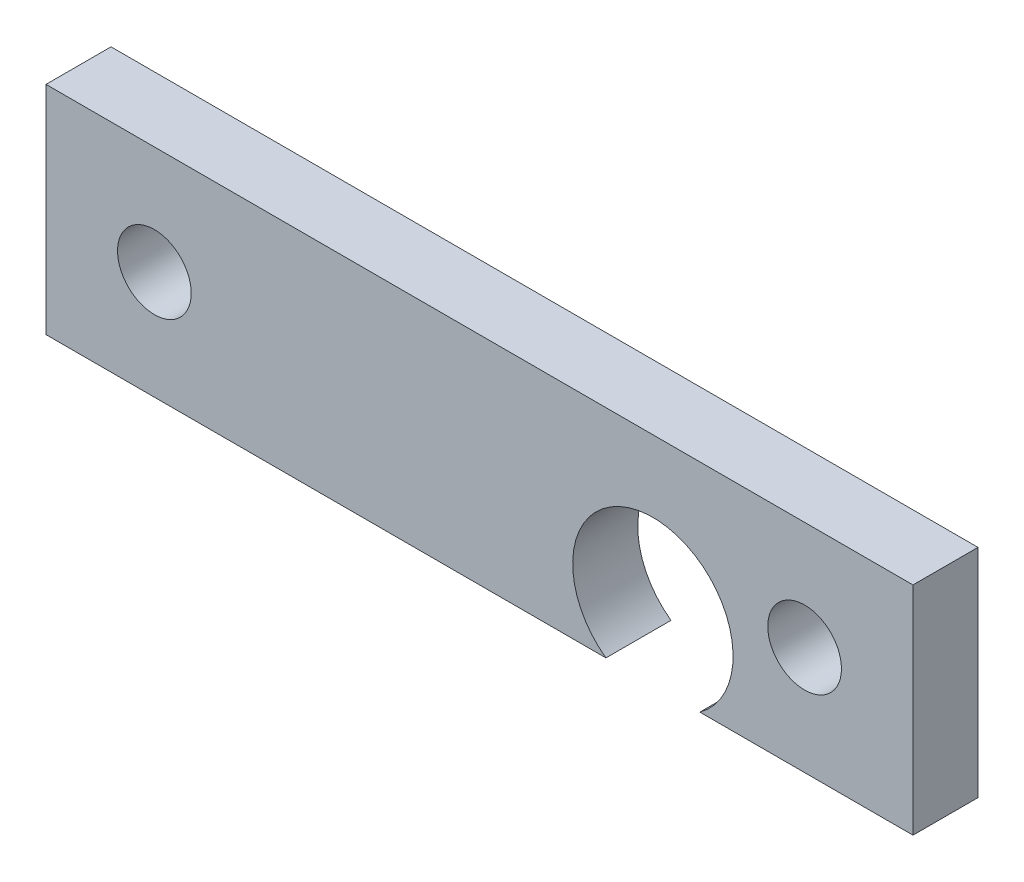
ISO-10303-21;
HEADER;
FILE_DESCRIPTION(('STEP AP214'),'2;1');
FILE_NAME('part.step','',(''),(''),'','','');
FILE_SCHEMA(('AUTOMOTIVE_DESIGN { 1 0 10303 214 1 1 1 1 }'));
ENDSEC;
DATA;
#1=APPLICATION_CONTEXT('core data for automotive mechanical design processes');
#2=APPLICATION_PROTOCOL_DEFINITION('international standard','automotive_design',2000,#1);
#3=PRODUCT_CONTEXT('',#1,'mechanical');
#4=PRODUCT('Part','Part','',(#3));
#5=PRODUCT_RELATED_PRODUCT_CATEGORY('part','',(#4));
#6=PRODUCT_DEFINITION_FORMATION('','',#4);
#7=PRODUCT_DEFINITION_CONTEXT('part definition',#1,'design');
#8=PRODUCT_DEFINITION('design','',#6,#7);
#9=PRODUCT_DEFINITION_SHAPE('','',#8);
#10=(LENGTH_UNIT() NAMED_UNIT(*) SI_UNIT(.MILLI.,.METRE.));
#11=(NAMED_UNIT(*) PLANE_ANGLE_UNIT() SI_UNIT($,.RADIAN.));
#12=(NAMED_UNIT(*) SI_UNIT($,.STERADIAN.) SOLID_ANGLE_UNIT());
#13=UNCERTAINTY_MEASURE_WITH_UNIT(LENGTH_MEASURE(1.E-05),#10,'distance_accuracy_value','');
#14=(GEOMETRIC_REPRESENTATION_CONTEXT(3) GLOBAL_UNCERTAINTY_ASSIGNED_CONTEXT((#13)) GLOBAL_UNIT_ASSIGNED_CONTEXT((#10,
#11,#12)) REPRESENTATION_CONTEXT('',''));
#15=CARTESIAN_POINT('',(0.,0.,0.));
#16=DIRECTION('',(0.,0.,1.));
#17=DIRECTION('',(1.,0.,0.));
#18=AXIS2_PLACEMENT_3D('',#15,#16,#17);
#19=CARTESIAN_POINT('',(-130.,41.5,41.5));
#20=DIRECTION('',(-1.,0.,0.));
#21=DIRECTION('',(0.,0.,1.));
#22=AXIS2_PLACEMENT_3D('',#19,#20,#21);
#23=PLANE('',#22);
#24=DIRECTION('',(0.,-1.,0.));
#25=VECTOR('',#24,1.);
#26=CARTESIAN_POINT('',(-130.,41.5,44.5));
#27=LINE('',#26,#25);
#28=CARTESIAN_POINT('',(-130.,41.5,44.5));
#29=VERTEX_POINT('',#28);
#30=CARTESIAN_POINT('',(-130.,31.5,44.5));
#31=VERTEX_POINT('',#30);
#32=EDGE_CURVE('E127',#29,#31,#27,.T.);
#33=ORIENTED_EDGE('',*,*,#32,.F.);
#34=DIRECTION('',(0.,0.,1.));
#35=VECTOR('',#34,1.);
#36=CARTESIAN_POINT('',(-130.,41.5,41.5));
#37=LINE('',#36,#35);
#38=CARTESIAN_POINT('',(-130.,41.5,41.5));
#39=VERTEX_POINT('',#38);
#40=EDGE_CURVE('E11',#39,#29,#37,.T.);
#41=ORIENTED_EDGE('',*,*,#40,.F.);
#42=DIRECTION('',(0.,-1.,0.));
#43=VECTOR('',#42,1.);
#44=CARTESIAN_POINT('',(-130.,41.5,41.5));
#45=LINE('',#44,#43);
#46=CARTESIAN_POINT('',(-130.,31.5,41.5));
#47=VERTEX_POINT('',#46);
#48=EDGE_CURVE('E143',#39,#47,#45,.T.);
#49=ORIENTED_EDGE('',*,*,#48,.T.);
#50=DIRECTION('',(0.,0.,1.));
#51=VECTOR('',#50,1.);
#52=CARTESIAN_POINT('',(-130.,31.5,41.5));
#53=LINE('',#52,#51);
#54=EDGE_CURVE('E42',#47,#31,#53,.T.);
#55=ORIENTED_EDGE('',*,*,#54,.T.);
#56=EDGE_LOOP('',(#33,#41,#49,#55));
#57=FACE_BOUND('',#56,.T.);
#58=ADVANCED_FACE('F41',(#57),#23,.T.);
#59=CARTESIAN_POINT('',(-130.,41.5,41.5));
#60=DIRECTION('',(0.,1.,0.));
#61=DIRECTION('',(0.,0.,1.));
#62=AXIS2_PLACEMENT_3D('',#59,#60,#61);
#63=PLANE('',#62);
#64=DIRECTION('',(-1.,0.,0.));
#65=VECTOR('',#64,1.);
#66=CARTESIAN_POINT('',(-130.,41.5,44.5));
#67=LINE('',#66,#65);
#68=CARTESIAN_POINT('',(-90.,41.5,44.5));
#69=VERTEX_POINT('',#68);
#70=EDGE_CURVE('E136',#69,#29,#67,.T.);
#71=ORIENTED_EDGE('',*,*,#70,.F.);
#72=DIRECTION('',(0.,0.,1.));
#73=VECTOR('',#72,1.);
#74=CARTESIAN_POINT('',(-90.,41.5,41.5));
#75=LINE('',#74,#73);
#76=CARTESIAN_POINT('',(-90.,41.5,41.5));
#77=VERTEX_POINT('',#76);
#78=EDGE_CURVE('E49',#77,#69,#75,.T.);
#79=ORIENTED_EDGE('',*,*,#78,.F.);
#80=DIRECTION('',(-1.,0.,0.));
#81=VECTOR('',#80,1.);
#82=CARTESIAN_POINT('',(-130.,41.5,41.5));
#83=LINE('',#82,#81);
#84=EDGE_CURVE('E117',#77,#39,#83,.T.);
#85=ORIENTED_EDGE('',*,*,#84,.T.);
#86=ORIENTED_EDGE('',*,*,#40,.T.);
#87=EDGE_LOOP('',(#71,#79,#85,#86));
#88=FACE_BOUND('',#87,.T.);
#89=ADVANCED_FACE('F149',(#88),#63,.T.);
#90=CARTESIAN_POINT('',(-90.,41.5,41.5));
#91=DIRECTION('',(1.,0.,0.));
#92=DIRECTION('',(0.,0.,-1.));
#93=AXIS2_PLACEMENT_3D('',#90,#91,#92);
#94=PLANE('',#93);
#95=DIRECTION('',(0.,1.,0.));
#96=VECTOR('',#95,1.);
#97=CARTESIAN_POINT('',(-90.,41.5,44.5));
#98=LINE('',#97,#96);
#99=CARTESIAN_POINT('',(-90.,31.5,44.5));
#100=VERTEX_POINT('',#99);
#101=EDGE_CURVE('E103',#100,#69,#98,.T.);
#102=ORIENTED_EDGE('',*,*,#101,.F.);
#103=DIRECTION('',(0.,0.,1.));
#104=VECTOR('',#103,1.);
#105=CARTESIAN_POINT('',(-90.,31.5,41.5));
#106=LINE('',#105,#104);
#107=CARTESIAN_POINT('',(-90.,31.5,41.5));
#108=VERTEX_POINT('',#107);
#109=EDGE_CURVE('E98',#108,#100,#106,.T.);
#110=ORIENTED_EDGE('',*,*,#109,.F.);
#111=DIRECTION('',(0.,1.,0.));
#112=VECTOR('',#111,1.);
#113=CARTESIAN_POINT('',(-90.,41.5,41.5));
#114=LINE('',#113,#112);
#115=EDGE_CURVE('E101',#108,#77,#114,.T.);
#116=ORIENTED_EDGE('',*,*,#115,.T.);
#117=ORIENTED_EDGE('',*,*,#78,.T.);
#118=EDGE_LOOP('',(#102,#110,#116,#117));
#119=FACE_BOUND('',#118,.T.);
#120=ADVANCED_FACE('F99',(#119),#94,.T.);
#121=CARTESIAN_POINT('',(-99.8343592172292,31.5,41.5));
#122=DIRECTION('',(0.,-1.,0.));
#123=DIRECTION('',(0.,0.,-1.));
#124=AXIS2_PLACEMENT_3D('',#121,#122,#123);
#125=PLANE('',#124);
#126=DIRECTION('',(1.,0.,0.));
#127=VECTOR('',#126,1.);
#128=CARTESIAN_POINT('',(-99.8343592172292,31.5,44.5));
#129=LINE('',#128,#127);
#130=CARTESIAN_POINT('',(-99.8343592172292,31.5,44.5));
#131=VERTEX_POINT('',#130);
#132=EDGE_CURVE('E137',#131,#100,#129,.T.);
#133=ORIENTED_EDGE('',*,*,#132,.F.);
#134=DIRECTION('',(0.,0.,1.));
#135=VECTOR('',#134,1.);
#136=CARTESIAN_POINT('',(-99.8343592172292,31.5,41.5));
#137=LINE('',#136,#135);
#138=CARTESIAN_POINT('',(-99.8343592172292,31.5,41.5));
#139=VERTEX_POINT('',#138);
#140=EDGE_CURVE('E107',#139,#131,#137,.T.);
#141=ORIENTED_EDGE('',*,*,#140,.F.);
#142=DIRECTION('',(1.,0.,0.));
#143=VECTOR('',#142,1.);
#144=CARTESIAN_POINT('',(-99.8343592172292,31.5,41.5));
#145=LINE('',#144,#143);
#146=EDGE_CURVE('E111',#139,#108,#145,.T.);
#147=ORIENTED_EDGE('',*,*,#146,.T.);
#148=ORIENTED_EDGE('',*,*,#109,.T.);
#149=EDGE_LOOP('',(#133,#141,#147,#148));
#150=FACE_BOUND('',#149,.T.);
#151=ADVANCED_FACE('F119',(#150),#125,.T.);
#152=CARTESIAN_POINT('',(-102.,34.5,41.5));
#153=DIRECTION('',(0.,0.,1.));
#154=DIRECTION('',(1.,0.,0.));
#155=AXIS2_PLACEMENT_3D('',#152,#153,#154);
#156=CYLINDRICAL_SURFACE('',#155,3.69999999999998);
#157=CARTESIAN_POINT('',(-102.,34.5,44.5));
#158=DIRECTION('',(0.,0.,-1.));
#159=DIRECTION('',(1.,0.,0.));
#160=AXIS2_PLACEMENT_3D('',#157,#158,#159);
#161=CIRCLE('',#160,3.69999999999998);
#162=CARTESIAN_POINT('',(-104.165640782771,31.4999999999999,44.5));
#163=VERTEX_POINT('',#162);
#164=EDGE_CURVE('E134',#163,#131,#161,.T.);
#165=ORIENTED_EDGE('',*,*,#164,.F.);
#166=DIRECTION('',(0.,0.,1.));
#167=VECTOR('',#166,1.);
#168=CARTESIAN_POINT('',(-104.165640782771,31.4999999999999,41.5));
#169=LINE('',#168,#167);
#170=CARTESIAN_POINT('',(-104.165640782771,31.4999999999999,41.5));
#171=VERTEX_POINT('',#170);
#172=EDGE_CURVE('E145',#171,#163,#169,.T.);
#173=ORIENTED_EDGE('',*,*,#172,.F.);
#174=CARTESIAN_POINT('',(-102.,34.5,41.5));
#175=DIRECTION('',(0.,0.,-1.));
#176=DIRECTION('',(1.,0.,0.));
#177=AXIS2_PLACEMENT_3D('',#174,#175,#176);
#178=CIRCLE('',#177,3.69999999999998);
#179=EDGE_CURVE('E116',#171,#139,#178,.T.);
#180=ORIENTED_EDGE('',*,*,#179,.T.);
#181=ORIENTED_EDGE('',*,*,#140,.T.);
#182=EDGE_LOOP('',(#165,#173,#180,#181));
#183=FACE_BOUND('',#182,.T.);
#184=ADVANCED_FACE('F165',(#183),#156,.F.);
#185=CARTESIAN_POINT('',(-130.,31.5,41.5));
#186=DIRECTION('',(0.,-1.,0.));
#187=DIRECTION('',(1.,0.,0.));
#188=AXIS2_PLACEMENT_3D('',#185,#186,#187);
#189=PLANE('',#188);
#190=DIRECTION('',(1.,0.,0.));
#191=VECTOR('',#190,1.);
#192=CARTESIAN_POINT('',(-130.,31.5,44.5));
#193=LINE('',#192,#191);
#194=EDGE_CURVE('E129',#31,#163,#193,.T.);
#195=ORIENTED_EDGE('',*,*,#194,.F.);
#196=ORIENTED_EDGE('',*,*,#54,.F.);
#197=DIRECTION('',(1.,0.,0.));
#198=VECTOR('',#197,1.);
#199=CARTESIAN_POINT('',(-130.,31.5,41.5));
#200=LINE('',#199,#198);
#201=EDGE_CURVE('E122',#47,#171,#200,.T.);
#202=ORIENTED_EDGE('',*,*,#201,.T.);
#203=ORIENTED_EDGE('',*,*,#172,.T.);
#204=EDGE_LOOP('',(#195,#196,#202,#203));
#205=FACE_BOUND('',#204,.T.);
#206=ADVANCED_FACE('F148',(#205),#189,.T.);
#207=CARTESIAN_POINT('',(-102.,34.5,41.5));
#208=DIRECTION('',(0.,0.,1.));
#209=DIRECTION('',(1.,0.,0.));
#210=AXIS2_PLACEMENT_3D('',#207,#208,#209);
#211=PLANE('',#210);
#212=CARTESIAN_POINT('',(-95.,36.5,41.5));
#213=DIRECTION('',(0.,0.,1.));
#214=DIRECTION('',(1.,0.,0.));
#215=AXIS2_PLACEMENT_3D('',#212,#213,#214);
#216=CIRCLE('',#215,1.69999999999999);
#217=CARTESIAN_POINT('',(-93.3,36.5,41.5));
#218=VERTEX_POINT('',#217);
#219=EDGE_CURVE('E189',#218,#218,#216,.T.);
#220=ORIENTED_EDGE('',*,*,#219,.T.);
#221=EDGE_LOOP('',(#220));
#222=FACE_BOUND('',#221,.T.);
#223=CARTESIAN_POINT('',(-125.,36.5,41.5));
#224=DIRECTION('',(0.,0.,1.));
#225=DIRECTION('',(1.,0.,0.));
#226=AXIS2_PLACEMENT_3D('',#223,#224,#225);
#227=CIRCLE('',#226,1.69999999999999);
#228=CARTESIAN_POINT('',(-123.3,36.5,41.5));
#229=VERTEX_POINT('',#228);
#230=EDGE_CURVE('E128',#229,#229,#227,.T.);
#231=ORIENTED_EDGE('',*,*,#230,.T.);
#232=EDGE_LOOP('',(#231));
#233=FACE_BOUND('',#232,.T.);
#234=ORIENTED_EDGE('',*,*,#48,.F.);
#235=ORIENTED_EDGE('',*,*,#84,.F.);
#236=ORIENTED_EDGE('',*,*,#115,.F.);
#237=ORIENTED_EDGE('',*,*,#146,.F.);
#238=ORIENTED_EDGE('',*,*,#179,.F.);
#239=ORIENTED_EDGE('',*,*,#201,.F.);
#240=EDGE_LOOP('',(#234,#235,#236,#237,#238,#239));
#241=FACE_BOUND('',#240,.T.);
#242=ADVANCED_FACE('F115',(#222,#233,#241),#211,.F.);
#243=CARTESIAN_POINT('',(-102.,34.5,44.5));
#244=DIRECTION('',(0.,0.,1.));
#245=DIRECTION('',(1.,0.,0.));
#246=AXIS2_PLACEMENT_3D('',#243,#244,#245);
#247=PLANE('',#246);
#248=CARTESIAN_POINT('',(-95.,36.5,44.5));
#249=DIRECTION('',(0.,0.,1.));
#250=DIRECTION('',(1.,0.,0.));
#251=AXIS2_PLACEMENT_3D('',#248,#249,#250);
#252=CIRCLE('',#251,1.69999999999999);
#253=CARTESIAN_POINT('',(-93.3,36.5,44.5));
#254=VERTEX_POINT('',#253);
#255=EDGE_CURVE('E192',#254,#254,#252,.T.);
#256=ORIENTED_EDGE('',*,*,#255,.F.);
#257=EDGE_LOOP('',(#256));
#258=FACE_BOUND('',#257,.T.);
#259=CARTESIAN_POINT('',(-125.,36.5,44.5));
#260=DIRECTION('',(0.,0.,1.));
#261=DIRECTION('',(1.,0.,0.));
#262=AXIS2_PLACEMENT_3D('',#259,#260,#261);
#263=CIRCLE('',#262,1.69999999999999);
#264=CARTESIAN_POINT('',(-123.3,36.5,44.5));
#265=VERTEX_POINT('',#264);
#266=EDGE_CURVE('E194',#265,#265,#263,.T.);
#267=ORIENTED_EDGE('',*,*,#266,.F.);
#268=EDGE_LOOP('',(#267));
#269=FACE_BOUND('',#268,.T.);
#270=ORIENTED_EDGE('',*,*,#32,.T.);
#271=ORIENTED_EDGE('',*,*,#194,.T.);
#272=ORIENTED_EDGE('',*,*,#164,.T.);
#273=ORIENTED_EDGE('',*,*,#132,.T.);
#274=ORIENTED_EDGE('',*,*,#101,.T.);
#275=ORIENTED_EDGE('',*,*,#70,.T.);
#276=EDGE_LOOP('',(#270,#271,#272,#273,#274,#275));
#277=FACE_BOUND('',#276,.T.);
#278=ADVANCED_FACE('F146',(#258,#269,#277),#247,.T.);
#279=CARTESIAN_POINT('',(-125.,36.5,41.5));
#280=DIRECTION('',(0.,0.,1.));
#281=DIRECTION('',(1.,0.,0.));
#282=AXIS2_PLACEMENT_3D('',#279,#280,#281);
#283=CYLINDRICAL_SURFACE('',#282,1.69999999999999);
#284=ORIENTED_EDGE('',*,*,#230,.F.);
#285=EDGE_LOOP('',(#284));
#286=FACE_BOUND('',#285,.T.);
#287=ORIENTED_EDGE('',*,*,#266,.T.);
#288=EDGE_LOOP('',(#287));
#289=FACE_BOUND('',#288,.T.);
#290=ADVANCED_FACE('F174',(#286,#289),#283,.F.);
#291=CARTESIAN_POINT('',(-95.,36.5,41.5));
#292=DIRECTION('',(0.,0.,1.));
#293=DIRECTION('',(1.,0.,0.));
#294=AXIS2_PLACEMENT_3D('',#291,#292,#293);
#295=CYLINDRICAL_SURFACE('',#294,1.69999999999999);
#296=ORIENTED_EDGE('',*,*,#219,.F.);
#297=EDGE_LOOP('',(#296));
#298=FACE_BOUND('',#297,.T.);
#299=ORIENTED_EDGE('',*,*,#255,.T.);
#300=EDGE_LOOP('',(#299));
#301=FACE_BOUND('',#300,.T.);
#302=ADVANCED_FACE('F178',(#298,#301),#295,.F.);
#303=CLOSED_SHELL('',(#58,#89,#120,#151,#184,#206,#242,#278,#290,#302));
#304=MANIFOLD_SOLID_BREP('B2',#303);
#305=ADVANCED_BREP_SHAPE_REPRESENTATION('',(#18,#304),#14);
#306=SHAPE_DEFINITION_REPRESENTATION(#9,#305);
ENDSEC;
END-ISO-10303-21;
